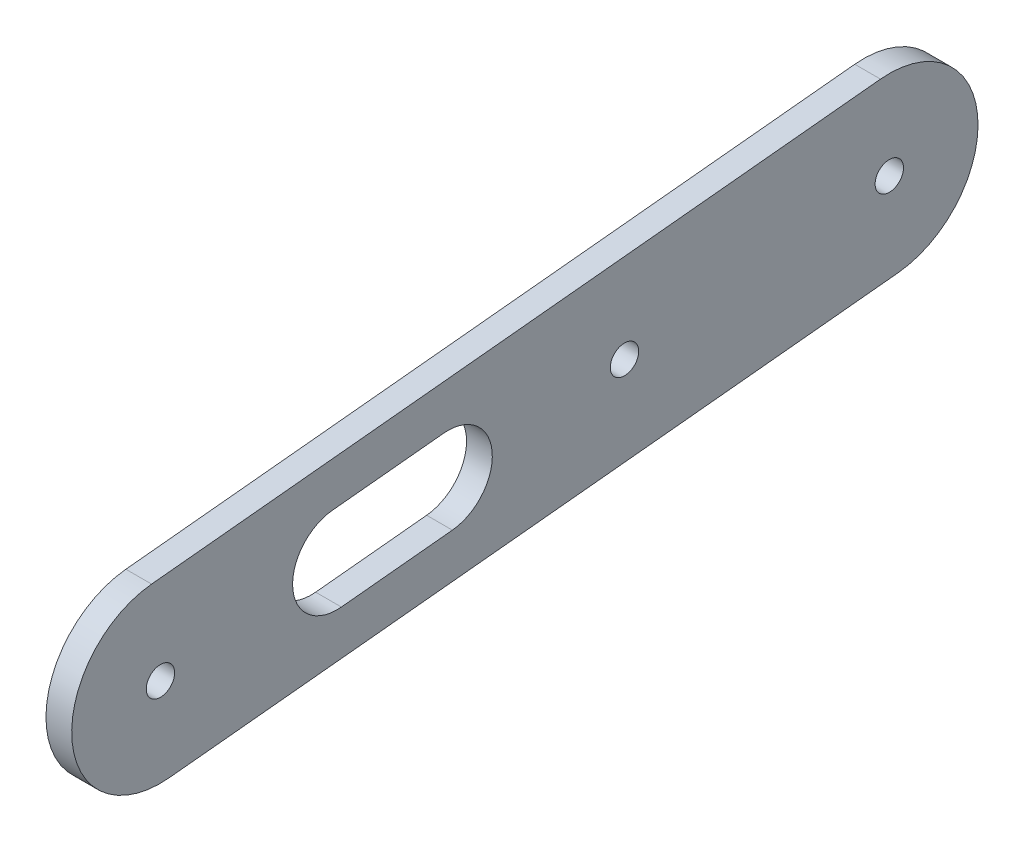
ISO-10303-21;
HEADER;
FILE_DESCRIPTION(('STEP AP214'),'2;1');
FILE_NAME('part.step','',(''),(''),'','','');
FILE_SCHEMA(('AUTOMOTIVE_DESIGN { 1 0 10303 214 1 1 1 1 }'));
ENDSEC;
DATA;
#1=APPLICATION_CONTEXT('core data for automotive mechanical design processes');
#2=APPLICATION_PROTOCOL_DEFINITION('international standard','automotive_design',2000,#1);
#3=PRODUCT_CONTEXT('',#1,'mechanical');
#4=PRODUCT('Part','Part','',(#3));
#5=PRODUCT_RELATED_PRODUCT_CATEGORY('part','',(#4));
#6=PRODUCT_DEFINITION_FORMATION('','',#4);
#7=PRODUCT_DEFINITION_CONTEXT('part definition',#1,'design');
#8=PRODUCT_DEFINITION('design','',#6,#7);
#9=PRODUCT_DEFINITION_SHAPE('','',#8);
#10=(LENGTH_UNIT() NAMED_UNIT(*) SI_UNIT(.MILLI.,.METRE.));
#11=(NAMED_UNIT(*) PLANE_ANGLE_UNIT() SI_UNIT($,.RADIAN.));
#12=(NAMED_UNIT(*) SI_UNIT($,.STERADIAN.) SOLID_ANGLE_UNIT());
#13=UNCERTAINTY_MEASURE_WITH_UNIT(LENGTH_MEASURE(1.E-05),#10,'distance_accuracy_value','');
#14=(GEOMETRIC_REPRESENTATION_CONTEXT(3) GLOBAL_UNCERTAINTY_ASSIGNED_CONTEXT((#13)) GLOBAL_UNIT_ASSIGNED_CONTEXT((#10,
#11,#12)) REPRESENTATION_CONTEXT('',''));
#15=CARTESIAN_POINT('',(0.,0.,0.));
#16=DIRECTION('',(0.,0.,1.));
#17=DIRECTION('',(1.,0.,0.));
#18=AXIS2_PLACEMENT_3D('',#15,#16,#17);
#19=CARTESIAN_POINT('',(-4.,263.21891012666,242.187453469388));
#20=DIRECTION('',(-1.,0.,0.));
#21=DIRECTION('',(0.,0.,1.));
#22=AXIS2_PLACEMENT_3D('',#19,#20,#21);
#23=PLANE('',#22);
#24=CARTESIAN_POINT('',(-4.,263.21891012666,242.187453469388));
#25=DIRECTION('',(-1.,0.,0.));
#26=DIRECTION('',(0.,0.,1.));
#27=AXIS2_PLACEMENT_3D('',#24,#25,#26);
#28=CIRCLE('',#27,10.);
#29=CARTESIAN_POINT('',(-4.,253.26853822456,241.192416279178));
#30=VERTEX_POINT('',#29);
#31=CARTESIAN_POINT('',(-4.,273.16928202876,243.182490659598));
#32=VERTEX_POINT('',#31);
#33=EDGE_CURVE('E115',#30,#32,#28,.T.);
#34=ORIENTED_EDGE('',*,*,#33,.T.);
#35=DIRECTION('',(0.,0.0995037190209978,-0.995037190209989));
#36=VECTOR('',#35,1.);
#37=CARTESIAN_POINT('',(-4.,273.16928202876,243.182490659598));
#38=LINE('',#37,#36);
#39=CARTESIAN_POINT('',(-4.,281.385696742486,161.01834352234));
#40=VERTEX_POINT('',#39);
#41=EDGE_CURVE('E153',#32,#40,#38,.T.);
#42=ORIENTED_EDGE('',*,*,#41,.T.);
#43=CARTESIAN_POINT('',(-4.,271.435324840386,160.02330633213));
#44=DIRECTION('',(-1.,0.,0.));
#45=DIRECTION('',(0.,0.,1.));
#46=AXIS2_PLACEMENT_3D('',#43,#44,#45);
#47=CIRCLE('',#46,10.);
#48=CARTESIAN_POINT('',(-4.,261.484952938286,159.02826914192));
#49=VERTEX_POINT('',#48);
#50=EDGE_CURVE('E156',#40,#49,#47,.T.);
#51=ORIENTED_EDGE('',*,*,#50,.T.);
#52=DIRECTION('',(0.,-0.0995037190209978,0.995037190209989));
#53=VECTOR('',#52,1.);
#54=CARTESIAN_POINT('',(-4.,253.26853822456,241.192416279178));
#55=LINE('',#54,#53);
#56=EDGE_CURVE('E142',#49,#30,#55,.T.);
#57=ORIENTED_EDGE('',*,*,#56,.T.);
#58=EDGE_LOOP('',(#34,#42,#51,#57));
#59=FACE_BOUND('',#58,.T.);
#60=CARTESIAN_POINT('',(-4.,266.460138889336,209.775165842631));
#61=DIRECTION('',(-1.,0.,0.));
#62=DIRECTION('',(0.,0.,1.));
#63=AXIS2_PLACEMENT_3D('',#60,#61,#62);
#64=CIRCLE('',#63,4.99999999999995);
#65=CARTESIAN_POINT('',(-4.,271.435324840386,210.272684437736));
#66=VERTEX_POINT('',#65);
#67=CARTESIAN_POINT('',(-4.,261.484952938286,209.277647247526));
#68=VERTEX_POINT('',#67);
#69=EDGE_CURVE('E60',#66,#68,#64,.T.);
#70=ORIENTED_EDGE('',*,*,#69,.F.);
#71=DIRECTION('',(0.,0.0995037190209963,-0.995037190209989));
#72=VECTOR('',#71,1.);
#73=CARTESIAN_POINT('',(-4.,271.435324840386,210.272684437736));
#74=LINE('',#73,#72);
#75=CARTESIAN_POINT('',(-4.,270.18417045813,222.784228260294));
#76=VERTEX_POINT('',#75);
#77=EDGE_CURVE('E109',#76,#66,#74,.T.);
#78=ORIENTED_EDGE('',*,*,#77,.F.);
#79=CARTESIAN_POINT('',(-4.,265.20898450708,222.286709665189));
#80=DIRECTION('',(-1.,0.,0.));
#81=DIRECTION('',(0.,0.,1.));
#82=AXIS2_PLACEMENT_3D('',#79,#80,#81);
#83=CIRCLE('',#82,5.00000000000001);
#84=CARTESIAN_POINT('',(-4.,260.23379855603,221.789191070084));
#85=VERTEX_POINT('',#84);
#86=EDGE_CURVE('E129',#85,#76,#83,.T.);
#87=ORIENTED_EDGE('',*,*,#86,.F.);
#88=DIRECTION('',(0.,-0.099503719021005,0.995037190209989));
#89=VECTOR('',#88,1.);
#90=CARTESIAN_POINT('',(-4.,261.484952938286,209.277647247526));
#91=LINE('',#90,#89);
#92=EDGE_CURVE('E123',#68,#85,#91,.T.);
#93=ORIENTED_EDGE('',*,*,#92,.F.);
#94=EDGE_LOOP('',(#70,#78,#87,#93));
#95=FACE_BOUND('',#94,.T.);
#96=CARTESIAN_POINT('',(-3.99999999999998,271.435324840386,160.02330633213));
#97=DIRECTION('',(1.,0.,0.));
#98=DIRECTION('',(0.,0.,-1.));
#99=AXIS2_PLACEMENT_3D('',#96,#97,#98);
#100=CIRCLE('',#99,1.59999999999999);
#101=CARTESIAN_POINT('',(-3.99999999999998,271.435324840386,158.42330633213));
#102=VERTEX_POINT('',#101);
#103=EDGE_CURVE('E238',#102,#102,#100,.T.);
#104=ORIENTED_EDGE('',*,*,#103,.T.);
#105=EDGE_LOOP('',(#104));
#106=FACE_BOUND('',#105,.T.);
#107=CARTESIAN_POINT('',(-3.99999999999998,268.450213269756,189.874422038431));
#108=DIRECTION('',(1.,0.,0.));
#109=DIRECTION('',(0.,0.,-1.));
#110=AXIS2_PLACEMENT_3D('',#107,#108,#109);
#111=CIRCLE('',#110,1.59999999999999);
#112=CARTESIAN_POINT('',(-3.99999999999998,268.450213269756,188.274422038431));
#113=VERTEX_POINT('',#112);
#114=EDGE_CURVE('E232',#113,#113,#111,.T.);
#115=ORIENTED_EDGE('',*,*,#114,.T.);
#116=EDGE_LOOP('',(#115));
#117=FACE_BOUND('',#116,.T.);
#118=CARTESIAN_POINT('',(-3.99999999999997,263.21891012666,242.187453469388));
#119=DIRECTION('',(1.,0.,0.));
#120=DIRECTION('',(0.,0.,-1.));
#121=AXIS2_PLACEMENT_3D('',#118,#119,#120);
#122=CIRCLE('',#121,1.59999999999999);
#123=CARTESIAN_POINT('',(-3.99999999999997,263.21891012666,240.587453469388));
#124=VERTEX_POINT('',#123);
#125=EDGE_CURVE('E222',#124,#124,#122,.T.);
#126=ORIENTED_EDGE('',*,*,#125,.T.);
#127=EDGE_LOOP('',(#126));
#128=FACE_BOUND('',#127,.T.);
#129=ADVANCED_FACE('F35',(#59,#95,#106,#117,#128),#23,.T.);
#130=CARTESIAN_POINT('',(-1.1,263.21891012666,242.187453469388));
#131=DIRECTION('',(-1.,0.,0.));
#132=DIRECTION('',(0.,0.,1.));
#133=AXIS2_PLACEMENT_3D('',#130,#131,#132);
#134=CYLINDRICAL_SURFACE('',#133,10.);
#135=ORIENTED_EDGE('',*,*,#33,.F.);
#136=DIRECTION('',(-1.,0.,0.));
#137=VECTOR('',#136,1.);
#138=CARTESIAN_POINT('',(-1.1,253.26853822456,241.192416279178));
#139=LINE('',#138,#137);
#140=CARTESIAN_POINT('',(-1.1,253.26853822456,241.192416279178));
#141=VERTEX_POINT('',#140);
#142=EDGE_CURVE('E11',#141,#30,#139,.T.);
#143=ORIENTED_EDGE('',*,*,#142,.F.);
#144=CARTESIAN_POINT('',(-1.1,263.21891012666,242.187453469388));
#145=DIRECTION('',(-1.,0.,0.));
#146=DIRECTION('',(0.,0.,1.));
#147=AXIS2_PLACEMENT_3D('',#144,#145,#146);
#148=CIRCLE('',#147,10.);
#149=CARTESIAN_POINT('',(-1.1,273.16928202876,243.182490659598));
#150=VERTEX_POINT('',#149);
#151=EDGE_CURVE('E138',#141,#150,#148,.T.);
#152=ORIENTED_EDGE('',*,*,#151,.T.);
#153=DIRECTION('',(-1.,0.,0.));
#154=VECTOR('',#153,1.);
#155=CARTESIAN_POINT('',(-1.1,273.16928202876,243.182490659598));
#156=LINE('',#155,#154);
#157=EDGE_CURVE('E39',#150,#32,#156,.T.);
#158=ORIENTED_EDGE('',*,*,#157,.T.);
#159=EDGE_LOOP('',(#135,#143,#152,#158));
#160=FACE_BOUND('',#159,.T.);
#161=ADVANCED_FACE('F37',(#160),#134,.T.);
#162=CARTESIAN_POINT('',(-1.1,253.26853822456,241.192416279178));
#163=DIRECTION('',(0.,-0.995037190209989,-0.0995037190209978));
#164=DIRECTION('',(0.,0.0995037190209978,-0.995037190209989));
#165=AXIS2_PLACEMENT_3D('',#162,#163,#164);
#166=PLANE('',#165);
#167=ORIENTED_EDGE('',*,*,#56,.F.);
#168=DIRECTION('',(-1.,0.,0.));
#169=VECTOR('',#168,1.);
#170=CARTESIAN_POINT('',(-1.1,261.484952938286,159.02826914192));
#171=LINE('',#170,#169);
#172=CARTESIAN_POINT('',(-1.1,261.484952938286,159.02826914192));
#173=VERTEX_POINT('',#172);
#174=EDGE_CURVE('E44',#173,#49,#171,.T.);
#175=ORIENTED_EDGE('',*,*,#174,.F.);
#176=DIRECTION('',(0.,-0.0995037190209978,0.995037190209989));
#177=VECTOR('',#176,1.);
#178=CARTESIAN_POINT('',(-1.1,253.26853822456,241.192416279178));
#179=LINE('',#178,#177);
#180=EDGE_CURVE('E148',#173,#141,#179,.T.);
#181=ORIENTED_EDGE('',*,*,#180,.T.);
#182=ORIENTED_EDGE('',*,*,#142,.T.);
#183=EDGE_LOOP('',(#167,#175,#181,#182));
#184=FACE_BOUND('',#183,.T.);
#185=ADVANCED_FACE('F174',(#184),#166,.T.);
#186=CARTESIAN_POINT('',(-1.1,271.435324840386,160.02330633213));
#187=DIRECTION('',(-1.,0.,0.));
#188=DIRECTION('',(0.,0.,1.));
#189=AXIS2_PLACEMENT_3D('',#186,#187,#188);
#190=CYLINDRICAL_SURFACE('',#189,10.);
#191=ORIENTED_EDGE('',*,*,#50,.F.);
#192=DIRECTION('',(-1.,0.,0.));
#193=VECTOR('',#192,1.);
#194=CARTESIAN_POINT('',(-1.1,281.385696742486,161.01834352234));
#195=LINE('',#194,#193);
#196=CARTESIAN_POINT('',(-1.1,281.385696742486,161.01834352234));
#197=VERTEX_POINT('',#196);
#198=EDGE_CURVE('E161',#197,#40,#195,.T.);
#199=ORIENTED_EDGE('',*,*,#198,.F.);
#200=CARTESIAN_POINT('',(-1.1,271.435324840386,160.02330633213));
#201=DIRECTION('',(-1.,0.,0.));
#202=DIRECTION('',(0.,0.,1.));
#203=AXIS2_PLACEMENT_3D('',#200,#201,#202);
#204=CIRCLE('',#203,10.);
#205=EDGE_CURVE('E145',#197,#173,#204,.T.);
#206=ORIENTED_EDGE('',*,*,#205,.T.);
#207=ORIENTED_EDGE('',*,*,#174,.T.);
#208=EDGE_LOOP('',(#191,#199,#206,#207));
#209=FACE_BOUND('',#208,.T.);
#210=ADVANCED_FACE('F178',(#209),#190,.T.);
#211=CARTESIAN_POINT('',(-1.1,273.16928202876,243.182490659598));
#212=DIRECTION('',(0.,0.995037190209989,0.0995037190209978));
#213=DIRECTION('',(0.,-0.0995037190209978,0.995037190209989));
#214=AXIS2_PLACEMENT_3D('',#211,#212,#213);
#215=PLANE('',#214);
#216=ORIENTED_EDGE('',*,*,#41,.F.);
#217=ORIENTED_EDGE('',*,*,#157,.F.);
#218=DIRECTION('',(0.,0.0995037190209978,-0.995037190209989));
#219=VECTOR('',#218,1.);
#220=CARTESIAN_POINT('',(-1.1,273.16928202876,243.182490659598));
#221=LINE('',#220,#219);
#222=EDGE_CURVE('E141',#150,#197,#221,.T.);
#223=ORIENTED_EDGE('',*,*,#222,.T.);
#224=ORIENTED_EDGE('',*,*,#198,.T.);
#225=EDGE_LOOP('',(#216,#217,#223,#224));
#226=FACE_BOUND('',#225,.T.);
#227=ADVANCED_FACE('F169',(#226),#215,.T.);
#228=CARTESIAN_POINT('',(-1.1,263.21891012666,242.187453469388));
#229=DIRECTION('',(-1.,0.,0.));
#230=DIRECTION('',(0.,0.,1.));
#231=AXIS2_PLACEMENT_3D('',#228,#229,#230);
#232=PLANE('',#231);
#233=CARTESIAN_POINT('',(-1.09999999999997,263.21891012666,242.187453469388));
#234=DIRECTION('',(1.,0.,0.));
#235=DIRECTION('',(0.,0.,-1.));
#236=AXIS2_PLACEMENT_3D('',#233,#234,#235);
#237=CIRCLE('',#236,1.59999999999999);
#238=CARTESIAN_POINT('',(-1.09999999999997,263.21891012666,240.587453469388));
#239=VERTEX_POINT('',#238);
#240=EDGE_CURVE('E225',#239,#239,#237,.T.);
#241=ORIENTED_EDGE('',*,*,#240,.F.);
#242=EDGE_LOOP('',(#241));
#243=FACE_BOUND('',#242,.T.);
#244=CARTESIAN_POINT('',(-1.09999999999998,268.450213269756,189.874422038431));
#245=DIRECTION('',(1.,0.,0.));
#246=DIRECTION('',(0.,0.,-1.));
#247=AXIS2_PLACEMENT_3D('',#244,#245,#246);
#248=CIRCLE('',#247,1.59999999999999);
#249=CARTESIAN_POINT('',(-1.09999999999998,268.450213269756,188.274422038431));
#250=VERTEX_POINT('',#249);
#251=EDGE_CURVE('E227',#250,#250,#248,.T.);
#252=ORIENTED_EDGE('',*,*,#251,.F.);
#253=EDGE_LOOP('',(#252));
#254=FACE_BOUND('',#253,.T.);
#255=CARTESIAN_POINT('',(-1.09999999999998,271.435324840386,160.02330633213));
#256=DIRECTION('',(1.,0.,0.));
#257=DIRECTION('',(0.,0.,-1.));
#258=AXIS2_PLACEMENT_3D('',#255,#256,#257);
#259=CIRCLE('',#258,1.59999999999999);
#260=CARTESIAN_POINT('',(-1.09999999999998,271.435324840386,158.42330633213));
#261=VERTEX_POINT('',#260);
#262=EDGE_CURVE('E235',#261,#261,#259,.T.);
#263=ORIENTED_EDGE('',*,*,#262,.F.);
#264=EDGE_LOOP('',(#263));
#265=FACE_BOUND('',#264,.T.);
#266=DIRECTION('',(0.,-0.0995037190209963,0.995037190209989));
#267=VECTOR('',#266,1.);
#268=CARTESIAN_POINT('',(-1.1,271.435324840386,210.272684437736));
#269=LINE('',#268,#267);
#270=CARTESIAN_POINT('',(-1.1,271.435324840386,210.272684437736));
#271=VERTEX_POINT('',#270);
#272=CARTESIAN_POINT('',(-1.1,270.18417045813,222.784228260294));
#273=VERTEX_POINT('',#272);
#274=EDGE_CURVE('E121',#271,#273,#269,.T.);
#275=ORIENTED_EDGE('',*,*,#274,.F.);
#276=CARTESIAN_POINT('',(-1.1,266.460138889336,209.775165842631));
#277=DIRECTION('',(-1.,0.,0.));
#278=DIRECTION('',(0.,0.,1.));
#279=AXIS2_PLACEMENT_3D('',#276,#277,#278);
#280=CIRCLE('',#279,4.99999999999995);
#281=CARTESIAN_POINT('',(-1.1,261.484952938286,209.277647247526));
#282=VERTEX_POINT('',#281);
#283=EDGE_CURVE('E103',#282,#271,#280,.F.);
#284=ORIENTED_EDGE('',*,*,#283,.F.);
#285=DIRECTION('',(0.,0.099503719021005,-0.995037190209989));
#286=VECTOR('',#285,1.);
#287=CARTESIAN_POINT('',(-1.1,261.484952938286,209.277647247526));
#288=LINE('',#287,#286);
#289=CARTESIAN_POINT('',(-1.1,260.23379855603,221.789191070084));
#290=VERTEX_POINT('',#289);
#291=EDGE_CURVE('E112',#290,#282,#288,.T.);
#292=ORIENTED_EDGE('',*,*,#291,.F.);
#293=CARTESIAN_POINT('',(-1.1,265.20898450708,222.286709665189));
#294=DIRECTION('',(-1.,0.,0.));
#295=DIRECTION('',(0.,0.,1.));
#296=AXIS2_PLACEMENT_3D('',#293,#294,#295);
#297=CIRCLE('',#296,5.00000000000001);
#298=EDGE_CURVE('E52',#273,#290,#297,.F.);
#299=ORIENTED_EDGE('',*,*,#298,.F.);
#300=EDGE_LOOP('',(#275,#284,#292,#299));
#301=FACE_BOUND('',#300,.T.);
#302=ORIENTED_EDGE('',*,*,#151,.F.);
#303=ORIENTED_EDGE('',*,*,#180,.F.);
#304=ORIENTED_EDGE('',*,*,#205,.F.);
#305=ORIENTED_EDGE('',*,*,#222,.F.);
#306=EDGE_LOOP('',(#302,#303,#304,#305));
#307=FACE_BOUND('',#306,.T.);
#308=ADVANCED_FACE('F118',(#243,#254,#265,#301,#307),#232,.F.);
#309=CARTESIAN_POINT('',(-1.099,266.460138889336,209.775165842631));
#310=DIRECTION('',(-1.,0.,0.));
#311=DIRECTION('',(0.,0.,1.));
#312=AXIS2_PLACEMENT_3D('',#309,#310,#311);
#313=CYLINDRICAL_SURFACE('',#312,4.99999999999995);
#314=ORIENTED_EDGE('',*,*,#283,.T.);
#315=DIRECTION('',(-1.,0.,0.));
#316=VECTOR('',#315,1.);
#317=CARTESIAN_POINT('',(-1.099,271.435324840386,210.272684437736));
#318=LINE('',#317,#316);
#319=EDGE_CURVE('E116',#271,#66,#318,.T.);
#320=ORIENTED_EDGE('',*,*,#319,.T.);
#321=ORIENTED_EDGE('',*,*,#69,.T.);
#322=DIRECTION('',(-1.,0.,0.));
#323=VECTOR('',#322,1.);
#324=CARTESIAN_POINT('',(-1.099,261.484952938286,209.277647247526));
#325=LINE('',#324,#323);
#326=EDGE_CURVE('E99',#282,#68,#325,.T.);
#327=ORIENTED_EDGE('',*,*,#326,.F.);
#328=EDGE_LOOP('',(#314,#320,#321,#327));
#329=FACE_BOUND('',#328,.T.);
#330=ADVANCED_FACE('F101',(#329),#313,.F.);
#331=CARTESIAN_POINT('',(-1.099,271.435324840386,210.272684437736));
#332=DIRECTION('',(0.,0.995037190209989,0.0995037190209963));
#333=DIRECTION('',(0.,-0.0995037190209963,0.995037190209989));
#334=AXIS2_PLACEMENT_3D('',#331,#332,#333);
#335=PLANE('',#334);
#336=ORIENTED_EDGE('',*,*,#274,.T.);
#337=DIRECTION('',(-1.,0.,0.));
#338=VECTOR('',#337,1.);
#339=CARTESIAN_POINT('',(-1.09899999999999,270.18417045813,222.784228260294));
#340=LINE('',#339,#338);
#341=EDGE_CURVE('E135',#273,#76,#340,.T.);
#342=ORIENTED_EDGE('',*,*,#341,.T.);
#343=ORIENTED_EDGE('',*,*,#77,.T.);
#344=ORIENTED_EDGE('',*,*,#319,.F.);
#345=EDGE_LOOP('',(#336,#342,#343,#344));
#346=FACE_BOUND('',#345,.T.);
#347=ADVANCED_FACE('F197',(#346),#335,.F.);
#348=CARTESIAN_POINT('',(-1.09899999999999,265.20898450708,222.286709665189));
#349=DIRECTION('',(-1.,0.,0.));
#350=DIRECTION('',(0.,0.,1.));
#351=AXIS2_PLACEMENT_3D('',#348,#349,#350);
#352=CYLINDRICAL_SURFACE('',#351,5.00000000000001);
#353=ORIENTED_EDGE('',*,*,#298,.T.);
#354=DIRECTION('',(-1.,0.,0.));
#355=VECTOR('',#354,1.);
#356=CARTESIAN_POINT('',(-1.09899999999999,260.23379855603,221.789191070084));
#357=LINE('',#356,#355);
#358=EDGE_CURVE('E108',#290,#85,#357,.T.);
#359=ORIENTED_EDGE('',*,*,#358,.T.);
#360=ORIENTED_EDGE('',*,*,#86,.T.);
#361=ORIENTED_EDGE('',*,*,#341,.F.);
#362=EDGE_LOOP('',(#353,#359,#360,#361));
#363=FACE_BOUND('',#362,.T.);
#364=ADVANCED_FACE('F201',(#363),#352,.F.);
#365=CARTESIAN_POINT('',(-1.099,261.484952938286,209.277647247526));
#366=DIRECTION('',(0.,-0.995037190209988,-0.099503719021005));
#367=DIRECTION('',(0.,0.099503719021005,-0.995037190209989));
#368=AXIS2_PLACEMENT_3D('',#365,#366,#367);
#369=PLANE('',#368);
#370=ORIENTED_EDGE('',*,*,#291,.T.);
#371=ORIENTED_EDGE('',*,*,#326,.T.);
#372=ORIENTED_EDGE('',*,*,#92,.T.);
#373=ORIENTED_EDGE('',*,*,#358,.F.);
#374=EDGE_LOOP('',(#370,#371,#372,#373));
#375=FACE_BOUND('',#374,.T.);
#376=ADVANCED_FACE('F113',(#375),#369,.F.);
#377=CARTESIAN_POINT('',(-1.09999999999998,271.435324840386,160.02330633213));
#378=DIRECTION('',(1.,0.,0.));
#379=DIRECTION('',(0.,0.,-1.));
#380=AXIS2_PLACEMENT_3D('',#377,#378,#379);
#381=CYLINDRICAL_SURFACE('',#380,1.59999999999999);
#382=ORIENTED_EDGE('',*,*,#103,.F.);
#383=EDGE_LOOP('',(#382));
#384=FACE_BOUND('',#383,.T.);
#385=ORIENTED_EDGE('',*,*,#262,.T.);
#386=EDGE_LOOP('',(#385));
#387=FACE_BOUND('',#386,.T.);
#388=ADVANCED_FACE('F200',(#384,#387),#381,.F.);
#389=CARTESIAN_POINT('',(-1.09999999999998,268.450213269756,189.874422038431));
#390=DIRECTION('',(1.,0.,0.));
#391=DIRECTION('',(0.,0.,-1.));
#392=AXIS2_PLACEMENT_3D('',#389,#390,#391);
#393=CYLINDRICAL_SURFACE('',#392,1.59999999999999);
#394=ORIENTED_EDGE('',*,*,#114,.F.);
#395=EDGE_LOOP('',(#394));
#396=FACE_BOUND('',#395,.T.);
#397=ORIENTED_EDGE('',*,*,#251,.T.);
#398=EDGE_LOOP('',(#397));
#399=FACE_BOUND('',#398,.T.);
#400=ADVANCED_FACE('F209',(#396,#399),#393,.F.);
#401=CARTESIAN_POINT('',(-1.09999999999997,263.21891012666,242.187453469388));
#402=DIRECTION('',(1.,0.,0.));
#403=DIRECTION('',(0.,0.,-1.));
#404=AXIS2_PLACEMENT_3D('',#401,#402,#403);
#405=CYLINDRICAL_SURFACE('',#404,1.59999999999999);
#406=ORIENTED_EDGE('',*,*,#125,.F.);
#407=EDGE_LOOP('',(#406));
#408=FACE_BOUND('',#407,.T.);
#409=ORIENTED_EDGE('',*,*,#240,.T.);
#410=EDGE_LOOP('',(#409));
#411=FACE_BOUND('',#410,.T.);
#412=ADVANCED_FACE('F213',(#408,#411),#405,.F.);
#413=CLOSED_SHELL('',(#129,#161,#185,#210,#227,#308,#330,#347,#364,#376,#388,#400,#412));
#414=MANIFOLD_SOLID_BREP('B2',#413);
#415=ADVANCED_BREP_SHAPE_REPRESENTATION('',(#18,#414),#14);
#416=SHAPE_DEFINITION_REPRESENTATION(#9,#415);
ENDSEC;
END-ISO-10303-21;
